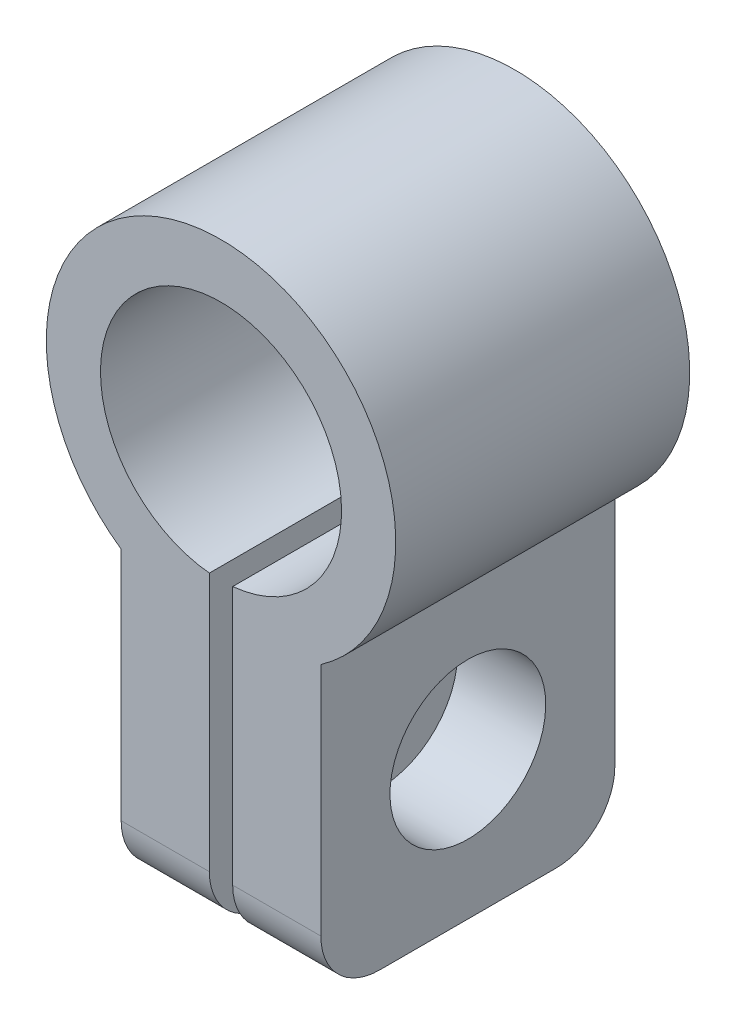
ISO-10303-21;
HEADER;
FILE_DESCRIPTION(('STEP AP214'),'2;1');
FILE_NAME('part.step','',(''),(''),'','','');
FILE_SCHEMA(('AUTOMOTIVE_DESIGN { 1 0 10303 214 1 1 1 1 }'));
ENDSEC;
DATA;
#1=APPLICATION_CONTEXT('core data for automotive mechanical design processes');
#2=APPLICATION_PROTOCOL_DEFINITION('international standard','automotive_design',2000,#1);
#3=PRODUCT_CONTEXT('',#1,'mechanical');
#4=PRODUCT('Part','Part','',(#3));
#5=PRODUCT_RELATED_PRODUCT_CATEGORY('part','',(#4));
#6=PRODUCT_DEFINITION_FORMATION('','',#4);
#7=PRODUCT_DEFINITION_CONTEXT('part definition',#1,'design');
#8=PRODUCT_DEFINITION('design','',#6,#7);
#9=PRODUCT_DEFINITION_SHAPE('','',#8);
#10=(LENGTH_UNIT() NAMED_UNIT(*) SI_UNIT(.MILLI.,.METRE.));
#11=(NAMED_UNIT(*) PLANE_ANGLE_UNIT() SI_UNIT($,.RADIAN.));
#12=(NAMED_UNIT(*) SI_UNIT($,.STERADIAN.) SOLID_ANGLE_UNIT());
#13=UNCERTAINTY_MEASURE_WITH_UNIT(LENGTH_MEASURE(1.E-05),#10,'distance_accuracy_value','');
#14=(GEOMETRIC_REPRESENTATION_CONTEXT(3) GLOBAL_UNCERTAINTY_ASSIGNED_CONTEXT((#13)) GLOBAL_UNIT_ASSIGNED_CONTEXT((#10,
#11,#12)) REPRESENTATION_CONTEXT('',''));
#15=CARTESIAN_POINT('',(0.,0.,0.));
#16=DIRECTION('',(0.,0.,1.));
#17=DIRECTION('',(1.,0.,0.));
#18=AXIS2_PLACEMENT_3D('',#15,#16,#17);
#19=CARTESIAN_POINT('',(0.,0.,10.));
#20=DIRECTION('',(0.,0.,-1.));
#21=DIRECTION('',(-1.,0.,0.));
#22=AXIS2_PLACEMENT_3D('',#19,#20,#21);
#23=CYLINDRICAL_SURFACE('',#22,4.1);
#24=CARTESIAN_POINT('',(0.,0.,0.));
#25=DIRECTION('',(0.,0.,-1.));
#26=DIRECTION('',(1.,0.,0.));
#27=AXIS2_PLACEMENT_3D('',#24,#25,#26);
#28=CIRCLE('',#27,4.1);
#29=CARTESIAN_POINT('',(-0.396848810495057,-4.08074883098784,0.));
#30=VERTEX_POINT('',#29);
#31=CARTESIAN_POINT('',(0.396848810495057,-4.08074883098784,0.));
#32=VERTEX_POINT('',#31);
#33=EDGE_CURVE('E156',#30,#32,#28,.T.);
#34=ORIENTED_EDGE('',*,*,#33,.T.);
#35=DIRECTION('',(0.,0.,-1.));
#36=VECTOR('',#35,1.);
#37=CARTESIAN_POINT('',(0.396848810495057,-4.08074883098784,10.));
#38=LINE('',#37,#36);
#39=CARTESIAN_POINT('',(0.396848810495057,-4.08074883098784,10.));
#40=VERTEX_POINT('',#39);
#41=EDGE_CURVE('E137',#40,#32,#38,.T.);
#42=ORIENTED_EDGE('',*,*,#41,.F.);
#43=CARTESIAN_POINT('',(0.,0.,10.));
#44=DIRECTION('',(0.,0.,-1.));
#45=DIRECTION('',(1.,0.,0.));
#46=AXIS2_PLACEMENT_3D('',#43,#44,#45);
#47=CIRCLE('',#46,4.1);
#48=CARTESIAN_POINT('',(-0.396848810495057,-4.08074883098784,10.));
#49=VERTEX_POINT('',#48);
#50=EDGE_CURVE('E142',#49,#40,#47,.T.);
#51=ORIENTED_EDGE('',*,*,#50,.F.);
#52=DIRECTION('',(0.,0.,-1.));
#53=VECTOR('',#52,1.);
#54=CARTESIAN_POINT('',(-0.396848810495057,-4.08074883098784,10.));
#55=LINE('',#54,#53);
#56=EDGE_CURVE('E234',#49,#30,#55,.T.);
#57=ORIENTED_EDGE('',*,*,#56,.T.);
#58=EDGE_LOOP('',(#34,#42,#51,#57));
#59=FACE_BOUND('',#58,.T.);
#60=ADVANCED_FACE('F42',(#59),#23,.F.);
#61=CARTESIAN_POINT('',(0.396848810495057,-4.08074883098784,10.));
#62=DIRECTION('',(1.,0.,0.));
#63=DIRECTION('',(0.,1.,0.));
#64=AXIS2_PLACEMENT_3D('',#61,#62,#63);
#65=PLANE('',#64);
#66=CARTESIAN_POINT('',(0.396848810495058,-9.87796998961877,5.));
#67=DIRECTION('',(1.,0.,0.));
#68=DIRECTION('',(0.,1.,0.));
#69=AXIS2_PLACEMENT_3D('',#66,#67,#68);
#70=CIRCLE('',#69,2.65);
#71=CARTESIAN_POINT('',(0.396848810495058,-7.22796998961877,5.));
#72=VERTEX_POINT('',#71);
#73=EDGE_CURVE('E238',#72,#72,#70,.T.);
#74=ORIENTED_EDGE('',*,*,#73,.T.);
#75=EDGE_LOOP('',(#74));
#76=FACE_BOUND('',#75,.T.);
#77=DIRECTION('',(0.,-1.,0.));
#78=VECTOR('',#77,1.);
#79=CARTESIAN_POINT('',(0.396848810495057,-4.08074883098784,0.));
#80=LINE('',#79,#78);
#81=CARTESIAN_POINT('',(0.396848810495058,-12.8779699896188,0.));
#82=VERTEX_POINT('',#81);
#83=EDGE_CURVE('E237',#32,#82,#80,.T.);
#84=ORIENTED_EDGE('',*,*,#83,.T.);
#85=CARTESIAN_POINT('',(0.396848810495058,-12.8779699896188,2.));
#86=DIRECTION('',(1.,0.,0.));
#87=DIRECTION('',(0.,1.,0.));
#88=AXIS2_PLACEMENT_3D('',#85,#86,#87);
#89=CIRCLE('',#88,2.);
#90=CARTESIAN_POINT('',(0.396848810495059,-14.8779699896188,2.));
#91=VERTEX_POINT('',#90);
#92=EDGE_CURVE('E211',#82,#91,#89,.F.);
#93=ORIENTED_EDGE('',*,*,#92,.T.);
#94=DIRECTION('',(0.,0.,-1.));
#95=VECTOR('',#94,1.);
#96=CARTESIAN_POINT('',(0.396848810495059,-14.8779699896188,10.));
#97=LINE('',#96,#95);
#98=CARTESIAN_POINT('',(0.396848810495059,-14.8779699896188,8.));
#99=VERTEX_POINT('',#98);
#100=EDGE_CURVE('E159',#99,#91,#97,.T.);
#101=ORIENTED_EDGE('',*,*,#100,.F.);
#102=CARTESIAN_POINT('',(0.396848810495058,-12.8779699896188,8.));
#103=DIRECTION('',(1.,0.,0.));
#104=DIRECTION('',(0.,1.,0.));
#105=AXIS2_PLACEMENT_3D('',#102,#103,#104);
#106=CIRCLE('',#105,2.);
#107=CARTESIAN_POINT('',(0.396848810495058,-12.8779699896188,10.));
#108=VERTEX_POINT('',#107);
#109=EDGE_CURVE('E58',#99,#108,#106,.F.);
#110=ORIENTED_EDGE('',*,*,#109,.T.);
#111=DIRECTION('',(0.,-1.,0.));
#112=VECTOR('',#111,1.);
#113=CARTESIAN_POINT('',(0.396848810495057,-4.08074883098784,10.));
#114=LINE('',#113,#112);
#115=EDGE_CURVE('E132',#40,#108,#114,.T.);
#116=ORIENTED_EDGE('',*,*,#115,.F.);
#117=ORIENTED_EDGE('',*,*,#41,.T.);
#118=EDGE_LOOP('',(#84,#93,#101,#110,#116,#117));
#119=FACE_BOUND('',#118,.T.);
#120=ADVANCED_FACE('F135',(#76,#119),#65,.F.);
#121=CARTESIAN_POINT('',(0.396848810495059,-14.8779699896188,10.));
#122=DIRECTION('',(0.,1.,0.));
#123=DIRECTION('',(0.,0.,1.));
#124=AXIS2_PLACEMENT_3D('',#121,#122,#123);
#125=PLANE('',#124);
#126=ORIENTED_EDGE('',*,*,#100,.T.);
#127=DIRECTION('',(1.,0.,0.));
#128=VECTOR('',#127,1.);
#129=CARTESIAN_POINT('',(0.396848810495059,-14.8779699896188,2.));
#130=LINE('',#129,#128);
#131=CARTESIAN_POINT('',(3.39684881049506,-14.8779699896188,2.));
#132=VERTEX_POINT('',#131);
#133=EDGE_CURVE('E200',#91,#132,#130,.T.);
#134=ORIENTED_EDGE('',*,*,#133,.T.);
#135=DIRECTION('',(0.,0.,-1.));
#136=VECTOR('',#135,1.);
#137=CARTESIAN_POINT('',(3.39684881049506,-14.8779699896188,10.));
#138=LINE('',#137,#136);
#139=CARTESIAN_POINT('',(3.39684881049506,-14.8779699896188,8.));
#140=VERTEX_POINT('',#139);
#141=EDGE_CURVE('E166',#140,#132,#138,.T.);
#142=ORIENTED_EDGE('',*,*,#141,.F.);
#143=DIRECTION('',(1.,0.,0.));
#144=VECTOR('',#143,1.);
#145=CARTESIAN_POINT('',(0.396848810495059,-14.8779699896188,8.));
#146=LINE('',#145,#144);
#147=EDGE_CURVE('E197',#140,#99,#146,.F.);
#148=ORIENTED_EDGE('',*,*,#147,.T.);
#149=EDGE_LOOP('',(#126,#134,#142,#148));
#150=FACE_BOUND('',#149,.T.);
#151=ADVANCED_FACE('F271',(#150),#125,.F.);
#152=CARTESIAN_POINT('',(3.39684881049506,-14.8779699896188,10.));
#153=DIRECTION('',(-1.,0.,0.));
#154=DIRECTION('',(0.,-1.,0.));
#155=AXIS2_PLACEMENT_3D('',#152,#153,#154);
#156=PLANE('',#155);
#157=CARTESIAN_POINT('',(3.39684881049506,-9.87796998961877,5.));
#158=DIRECTION('',(1.,0.,0.));
#159=DIRECTION('',(0.,1.,0.));
#160=AXIS2_PLACEMENT_3D('',#157,#158,#159);
#161=CIRCLE('',#160,2.65);
#162=CARTESIAN_POINT('',(3.39684881049506,-7.22796998961877,5.));
#163=VERTEX_POINT('',#162);
#164=EDGE_CURVE('E174',#163,#163,#161,.T.);
#165=ORIENTED_EDGE('',*,*,#164,.F.);
#166=EDGE_LOOP('',(#165));
#167=FACE_BOUND('',#166,.T.);
#168=ORIENTED_EDGE('',*,*,#141,.T.);
#169=CARTESIAN_POINT('',(3.39684881049506,-12.8779699896188,2.));
#170=DIRECTION('',(-1.,0.,0.));
#171=DIRECTION('',(0.,-1.,0.));
#172=AXIS2_PLACEMENT_3D('',#169,#170,#171);
#173=CIRCLE('',#172,2.);
#174=CARTESIAN_POINT('',(3.39684881049506,-12.8779699896188,0.));
#175=VERTEX_POINT('',#174);
#176=EDGE_CURVE('E206',#132,#175,#173,.F.);
#177=ORIENTED_EDGE('',*,*,#176,.T.);
#178=DIRECTION('',(0.,1.,0.));
#179=VECTOR('',#178,1.);
#180=CARTESIAN_POINT('',(3.39684881049506,-14.8779699896188,0.));
#181=LINE('',#180,#179);
#182=CARTESIAN_POINT('',(3.39684881049505,-4.87796998961876,0.));
#183=VERTEX_POINT('',#182);
#184=EDGE_CURVE('E241',#175,#183,#181,.T.);
#185=ORIENTED_EDGE('',*,*,#184,.T.);
#186=DIRECTION('',(0.,0.,-1.));
#187=VECTOR('',#186,1.);
#188=CARTESIAN_POINT('',(3.39684881049505,-4.87796998961876,10.));
#189=LINE('',#188,#187);
#190=CARTESIAN_POINT('',(3.39684881049505,-4.87796998961876,10.));
#191=VERTEX_POINT('',#190);
#192=EDGE_CURVE('E221',#191,#183,#189,.T.);
#193=ORIENTED_EDGE('',*,*,#192,.F.);
#194=DIRECTION('',(0.,1.,0.));
#195=VECTOR('',#194,1.);
#196=CARTESIAN_POINT('',(3.39684881049506,-14.8779699896188,10.));
#197=LINE('',#196,#195);
#198=CARTESIAN_POINT('',(3.39684881049506,-12.8779699896188,10.));
#199=VERTEX_POINT('',#198);
#200=EDGE_CURVE('E141',#199,#191,#197,.T.);
#201=ORIENTED_EDGE('',*,*,#200,.F.);
#202=CARTESIAN_POINT('',(3.39684881049506,-12.8779699896188,8.));
#203=DIRECTION('',(-1.,0.,0.));
#204=DIRECTION('',(0.,-1.,0.));
#205=AXIS2_PLACEMENT_3D('',#202,#203,#204);
#206=CIRCLE('',#205,2.);
#207=EDGE_CURVE('E66',#199,#140,#206,.F.);
#208=ORIENTED_EDGE('',*,*,#207,.T.);
#209=EDGE_LOOP('',(#168,#177,#185,#193,#201,#208));
#210=FACE_BOUND('',#209,.T.);
#211=ADVANCED_FACE('F218',(#167,#210),#156,.F.);
#212=CARTESIAN_POINT('',(0.,0.,10.));
#213=DIRECTION('',(0.,0.,-1.));
#214=DIRECTION('',(-1.,0.,0.));
#215=AXIS2_PLACEMENT_3D('',#212,#213,#214);
#216=CYLINDRICAL_SURFACE('',#215,5.94417135191971);
#217=CARTESIAN_POINT('',(0.,0.,0.));
#218=DIRECTION('',(0.,0.,1.));
#219=DIRECTION('',(1.,0.,0.));
#220=AXIS2_PLACEMENT_3D('',#217,#218,#219);
#221=CIRCLE('',#220,5.94417135191971);
#222=CARTESIAN_POINT('',(-3.39684881049506,-4.87796998961876,0.));
#223=VERTEX_POINT('',#222);
#224=EDGE_CURVE('E244',#183,#223,#221,.T.);
#225=ORIENTED_EDGE('',*,*,#224,.T.);
#226=DIRECTION('',(0.,0.,-1.));
#227=VECTOR('',#226,1.);
#228=CARTESIAN_POINT('',(-3.39684881049506,-4.87796998961876,10.));
#229=LINE('',#228,#227);
#230=CARTESIAN_POINT('',(-3.39684881049506,-4.87796998961876,10.));
#231=VERTEX_POINT('',#230);
#232=EDGE_CURVE('E263',#231,#223,#229,.T.);
#233=ORIENTED_EDGE('',*,*,#232,.F.);
#234=CARTESIAN_POINT('',(0.,0.,10.));
#235=DIRECTION('',(0.,0.,1.));
#236=DIRECTION('',(1.,0.,0.));
#237=AXIS2_PLACEMENT_3D('',#234,#235,#236);
#238=CIRCLE('',#237,5.94417135191971);
#239=EDGE_CURVE('E224',#191,#231,#238,.T.);
#240=ORIENTED_EDGE('',*,*,#239,.F.);
#241=ORIENTED_EDGE('',*,*,#192,.T.);
#242=EDGE_LOOP('',(#225,#233,#240,#241));
#243=FACE_BOUND('',#242,.T.);
#244=ADVANCED_FACE('F307',(#243),#216,.T.);
#245=CARTESIAN_POINT('',(-3.39684881049505,-14.8779699896188,10.));
#246=DIRECTION('',(1.,0.,0.));
#247=DIRECTION('',(0.,1.,0.));
#248=AXIS2_PLACEMENT_3D('',#245,#246,#247);
#249=PLANE('',#248);
#250=CARTESIAN_POINT('',(-3.39684881049506,-9.87796998961877,5.));
#251=DIRECTION('',(1.,0.,0.));
#252=DIRECTION('',(0.,1.,0.));
#253=AXIS2_PLACEMENT_3D('',#250,#251,#252);
#254=CIRCLE('',#253,2.65);
#255=CARTESIAN_POINT('',(-3.39684881049506,-7.22796998961877,5.));
#256=VERTEX_POINT('',#255);
#257=EDGE_CURVE('E173',#256,#256,#254,.T.);
#258=ORIENTED_EDGE('',*,*,#257,.T.);
#259=EDGE_LOOP('',(#258));
#260=FACE_BOUND('',#259,.T.);
#261=DIRECTION('',(0.,-1.,0.));
#262=VECTOR('',#261,1.);
#263=CARTESIAN_POINT('',(-3.39684881049505,-14.8779699896188,0.));
#264=LINE('',#263,#262);
#265=CARTESIAN_POINT('',(-3.39684881049506,-12.8779699896188,0.));
#266=VERTEX_POINT('',#265);
#267=EDGE_CURVE('E247',#223,#266,#264,.T.);
#268=ORIENTED_EDGE('',*,*,#267,.T.);
#269=CARTESIAN_POINT('',(-3.39684881049506,-12.8779699896188,2.));
#270=DIRECTION('',(1.,0.,0.));
#271=DIRECTION('',(0.,1.,0.));
#272=AXIS2_PLACEMENT_3D('',#269,#270,#271);
#273=CIRCLE('',#272,2.);
#274=CARTESIAN_POINT('',(-3.39684881049505,-14.8779699896188,2.));
#275=VERTEX_POINT('',#274);
#276=EDGE_CURVE('E194',#266,#275,#273,.F.);
#277=ORIENTED_EDGE('',*,*,#276,.T.);
#278=DIRECTION('',(0.,0.,-1.));
#279=VECTOR('',#278,1.);
#280=CARTESIAN_POINT('',(-3.39684881049505,-14.8779699896188,10.));
#281=LINE('',#280,#279);
#282=CARTESIAN_POINT('',(-3.39684881049505,-14.8779699896188,8.));
#283=VERTEX_POINT('',#282);
#284=EDGE_CURVE('E259',#283,#275,#281,.T.);
#285=ORIENTED_EDGE('',*,*,#284,.F.);
#286=CARTESIAN_POINT('',(-3.39684881049506,-12.8779699896188,8.));
#287=DIRECTION('',(1.,0.,0.));
#288=DIRECTION('',(0.,1.,0.));
#289=AXIS2_PLACEMENT_3D('',#286,#287,#288);
#290=CIRCLE('',#289,2.);
#291=CARTESIAN_POINT('',(-3.39684881049506,-12.8779699896188,10.));
#292=VERTEX_POINT('',#291);
#293=EDGE_CURVE('E191',#283,#292,#290,.F.);
#294=ORIENTED_EDGE('',*,*,#293,.T.);
#295=DIRECTION('',(0.,-1.,0.));
#296=VECTOR('',#295,1.);
#297=CARTESIAN_POINT('',(-3.39684881049505,-14.8779699896188,10.));
#298=LINE('',#297,#296);
#299=EDGE_CURVE('E227',#231,#292,#298,.T.);
#300=ORIENTED_EDGE('',*,*,#299,.F.);
#301=ORIENTED_EDGE('',*,*,#232,.T.);
#302=EDGE_LOOP('',(#268,#277,#285,#294,#300,#301));
#303=FACE_BOUND('',#302,.T.);
#304=ADVANCED_FACE('F323',(#260,#303),#249,.F.);
#305=CARTESIAN_POINT('',(-0.396848810495055,-14.8779699896188,10.));
#306=DIRECTION('',(0.,1.,0.));
#307=DIRECTION('',(0.,0.,1.));
#308=AXIS2_PLACEMENT_3D('',#305,#306,#307);
#309=PLANE('',#308);
#310=ORIENTED_EDGE('',*,*,#284,.T.);
#311=DIRECTION('',(1.,0.,0.));
#312=VECTOR('',#311,1.);
#313=CARTESIAN_POINT('',(-0.396848810495055,-14.8779699896188,2.));
#314=LINE('',#313,#312);
#315=CARTESIAN_POINT('',(-0.396848810495055,-14.8779699896188,2.));
#316=VERTEX_POINT('',#315);
#317=EDGE_CURVE('E163',#275,#316,#314,.T.);
#318=ORIENTED_EDGE('',*,*,#317,.T.);
#319=DIRECTION('',(0.,0.,-1.));
#320=VECTOR('',#319,1.);
#321=CARTESIAN_POINT('',(-0.396848810495055,-14.8779699896188,10.));
#322=LINE('',#321,#320);
#323=CARTESIAN_POINT('',(-0.396848810495055,-14.8779699896188,8.));
#324=VERTEX_POINT('',#323);
#325=EDGE_CURVE('E255',#324,#316,#322,.T.);
#326=ORIENTED_EDGE('',*,*,#325,.F.);
#327=DIRECTION('',(1.,0.,0.));
#328=VECTOR('',#327,1.);
#329=CARTESIAN_POINT('',(-3.39684881049505,-14.8779699896188,8.));
#330=LINE('',#329,#328);
#331=EDGE_CURVE('E158',#324,#283,#330,.F.);
#332=ORIENTED_EDGE('',*,*,#331,.T.);
#333=EDGE_LOOP('',(#310,#318,#326,#332));
#334=FACE_BOUND('',#333,.T.);
#335=ADVANCED_FACE('F318',(#334),#309,.F.);
#336=CARTESIAN_POINT('',(-0.396848810495057,-4.08074883098784,10.));
#337=DIRECTION('',(-1.,0.,0.));
#338=DIRECTION('',(0.,-1.,0.));
#339=AXIS2_PLACEMENT_3D('',#336,#337,#338);
#340=PLANE('',#339);
#341=CARTESIAN_POINT('',(-0.396848810495056,-9.87796998961877,5.));
#342=DIRECTION('',(-1.,0.,0.));
#343=DIRECTION('',(0.,-1.,0.));
#344=AXIS2_PLACEMENT_3D('',#341,#342,#343);
#345=CIRCLE('',#344,2.65);
#346=CARTESIAN_POINT('',(-0.396848810495056,-12.5279699896188,5.));
#347=VERTEX_POINT('',#346);
#348=EDGE_CURVE('E170',#347,#347,#345,.T.);
#349=ORIENTED_EDGE('',*,*,#348,.T.);
#350=EDGE_LOOP('',(#349));
#351=FACE_BOUND('',#350,.T.);
#352=ORIENTED_EDGE('',*,*,#325,.T.);
#353=CARTESIAN_POINT('',(-0.396848810495055,-12.8779699896188,2.));
#354=DIRECTION('',(-1.,0.,0.));
#355=DIRECTION('',(0.,-1.,0.));
#356=AXIS2_PLACEMENT_3D('',#353,#354,#355);
#357=CIRCLE('',#356,2.);
#358=CARTESIAN_POINT('',(-0.396848810495055,-12.8779699896188,0.));
#359=VERTEX_POINT('',#358);
#360=EDGE_CURVE('E182',#316,#359,#357,.F.);
#361=ORIENTED_EDGE('',*,*,#360,.T.);
#362=DIRECTION('',(0.,1.,0.));
#363=VECTOR('',#362,1.);
#364=CARTESIAN_POINT('',(-0.396848810495057,-4.08074883098784,0.));
#365=LINE('',#364,#363);
#366=EDGE_CURVE('E153',#359,#30,#365,.T.);
#367=ORIENTED_EDGE('',*,*,#366,.T.);
#368=ORIENTED_EDGE('',*,*,#56,.F.);
#369=DIRECTION('',(0.,1.,0.));
#370=VECTOR('',#369,1.);
#371=CARTESIAN_POINT('',(-0.396848810495057,-4.08074883098784,10.));
#372=LINE('',#371,#370);
#373=CARTESIAN_POINT('',(-0.396848810495055,-12.8779699896188,10.));
#374=VERTEX_POINT('',#373);
#375=EDGE_CURVE('E148',#374,#49,#372,.T.);
#376=ORIENTED_EDGE('',*,*,#375,.F.);
#377=CARTESIAN_POINT('',(-0.396848810495055,-12.8779699896188,8.));
#378=DIRECTION('',(-1.,0.,0.));
#379=DIRECTION('',(0.,-1.,0.));
#380=AXIS2_PLACEMENT_3D('',#377,#378,#379);
#381=CIRCLE('',#380,2.);
#382=EDGE_CURVE('E179',#374,#324,#381,.F.);
#383=ORIENTED_EDGE('',*,*,#382,.T.);
#384=EDGE_LOOP('',(#352,#361,#367,#368,#376,#383));
#385=FACE_BOUND('',#384,.T.);
#386=ADVANCED_FACE('F316',(#351,#385),#340,.F.);
#387=CARTESIAN_POINT('',(0.,0.,10.));
#388=DIRECTION('',(0.,0.,1.));
#389=DIRECTION('',(1.,0.,0.));
#390=AXIS2_PLACEMENT_3D('',#387,#388,#389);
#391=PLANE('',#390);
#392=ORIENTED_EDGE('',*,*,#299,.T.);
#393=DIRECTION('',(1.,0.,0.));
#394=VECTOR('',#393,1.);
#395=CARTESIAN_POINT('',(-0.396848810495055,-12.8779699896188,10.));
#396=LINE('',#395,#394);
#397=EDGE_CURVE('E11',#292,#374,#396,.T.);
#398=ORIENTED_EDGE('',*,*,#397,.T.);
#399=ORIENTED_EDGE('',*,*,#375,.T.);
#400=ORIENTED_EDGE('',*,*,#50,.T.);
#401=ORIENTED_EDGE('',*,*,#115,.T.);
#402=DIRECTION('',(1.,0.,0.));
#403=VECTOR('',#402,1.);
#404=CARTESIAN_POINT('',(3.39684881049506,-12.8779699896188,10.));
#405=LINE('',#404,#403);
#406=EDGE_CURVE('E51',#108,#199,#405,.T.);
#407=ORIENTED_EDGE('',*,*,#406,.T.);
#408=ORIENTED_EDGE('',*,*,#200,.T.);
#409=ORIENTED_EDGE('',*,*,#239,.T.);
#410=EDGE_LOOP('',(#392,#398,#399,#400,#401,#407,#408,#409));
#411=FACE_BOUND('',#410,.T.);
#412=ADVANCED_FACE('F146',(#411),#391,.T.);
#413=CARTESIAN_POINT('',(0.,0.,0.));
#414=DIRECTION('',(0.,0.,1.));
#415=DIRECTION('',(1.,0.,0.));
#416=AXIS2_PLACEMENT_3D('',#413,#414,#415);
#417=PLANE('',#416);
#418=ORIENTED_EDGE('',*,*,#366,.F.);
#419=DIRECTION('',(1.,0.,0.));
#420=VECTOR('',#419,1.);
#421=CARTESIAN_POINT('',(0.,-12.8779699896188,0.));
#422=LINE('',#421,#420);
#423=EDGE_CURVE('E188',#359,#266,#422,.F.);
#424=ORIENTED_EDGE('',*,*,#423,.T.);
#425=ORIENTED_EDGE('',*,*,#267,.F.);
#426=ORIENTED_EDGE('',*,*,#224,.F.);
#427=ORIENTED_EDGE('',*,*,#184,.F.);
#428=DIRECTION('',(1.,0.,0.));
#429=VECTOR('',#428,1.);
#430=CARTESIAN_POINT('',(0.,-12.8779699896188,0.));
#431=LINE('',#430,#429);
#432=EDGE_CURVE('E185',#175,#82,#431,.F.);
#433=ORIENTED_EDGE('',*,*,#432,.T.);
#434=ORIENTED_EDGE('',*,*,#83,.F.);
#435=ORIENTED_EDGE('',*,*,#33,.F.);
#436=EDGE_LOOP('',(#418,#424,#425,#426,#427,#433,#434,#435));
#437=FACE_BOUND('',#436,.T.);
#438=ADVANCED_FACE('F303',(#437),#417,.F.);
#439=CARTESIAN_POINT('',(-6.60315118950494,-9.87796998961877,5.));
#440=DIRECTION('',(1.,0.,0.));
#441=DIRECTION('',(0.,1.,0.));
#442=AXIS2_PLACEMENT_3D('',#439,#440,#441);
#443=CYLINDRICAL_SURFACE('',#442,2.65);
#444=ORIENTED_EDGE('',*,*,#348,.F.);
#445=EDGE_LOOP('',(#444));
#446=FACE_BOUND('',#445,.T.);
#447=ORIENTED_EDGE('',*,*,#257,.F.);
#448=EDGE_LOOP('',(#447));
#449=FACE_BOUND('',#448,.T.);
#450=ADVANCED_FACE('F392',(#446,#449),#443,.F.);
#451=ORIENTED_EDGE('',*,*,#164,.T.);
#452=EDGE_LOOP('',(#451));
#453=FACE_BOUND('',#452,.T.);
#454=ORIENTED_EDGE('',*,*,#73,.F.);
#455=EDGE_LOOP('',(#454));
#456=FACE_BOUND('',#455,.T.);
#457=ADVANCED_FACE('F293',(#453,#456),#443,.F.);
#458=CARTESIAN_POINT('',(-0.396848810495055,-12.8779699896188,2.));
#459=DIRECTION('',(1.,0.,0.));
#460=DIRECTION('',(0.,0.,-1.));
#461=AXIS2_PLACEMENT_3D('',#458,#459,#460);
#462=CYLINDRICAL_SURFACE('',#461,2.);
#463=ORIENTED_EDGE('',*,*,#276,.F.);
#464=ORIENTED_EDGE('',*,*,#423,.F.);
#465=ORIENTED_EDGE('',*,*,#360,.F.);
#466=ORIENTED_EDGE('',*,*,#317,.F.);
#467=EDGE_LOOP('',(#463,#464,#465,#466));
#468=FACE_BOUND('',#467,.T.);
#469=ADVANCED_FACE('F290',(#468),#462,.T.);
#470=CARTESIAN_POINT('',(0.396848810495059,-12.8779699896188,2.));
#471=DIRECTION('',(1.,0.,0.));
#472=DIRECTION('',(0.,0.,-1.));
#473=AXIS2_PLACEMENT_3D('',#470,#471,#472);
#474=CYLINDRICAL_SURFACE('',#473,2.);
#475=ORIENTED_EDGE('',*,*,#92,.F.);
#476=ORIENTED_EDGE('',*,*,#432,.F.);
#477=ORIENTED_EDGE('',*,*,#176,.F.);
#478=ORIENTED_EDGE('',*,*,#133,.F.);
#479=EDGE_LOOP('',(#475,#476,#477,#478));
#480=FACE_BOUND('',#479,.T.);
#481=ADVANCED_FACE('F278',(#480),#474,.T.);
#482=CARTESIAN_POINT('',(0.,-12.8779699896188,8.));
#483=DIRECTION('',(-1.,0.,0.));
#484=DIRECTION('',(0.,0.,1.));
#485=AXIS2_PLACEMENT_3D('',#482,#483,#484);
#486=CYLINDRICAL_SURFACE('',#485,2.);
#487=ORIENTED_EDGE('',*,*,#293,.F.);
#488=ORIENTED_EDGE('',*,*,#331,.F.);
#489=ORIENTED_EDGE('',*,*,#382,.F.);
#490=ORIENTED_EDGE('',*,*,#397,.F.);
#491=EDGE_LOOP('',(#487,#488,#489,#490));
#492=FACE_BOUND('',#491,.T.);
#493=ADVANCED_FACE('F274',(#492),#486,.T.);
#494=CARTESIAN_POINT('',(0.,-12.8779699896188,8.));
#495=DIRECTION('',(-1.,0.,0.));
#496=DIRECTION('',(0.,0.,1.));
#497=AXIS2_PLACEMENT_3D('',#494,#495,#496);
#498=CYLINDRICAL_SURFACE('',#497,2.);
#499=ORIENTED_EDGE('',*,*,#109,.F.);
#500=ORIENTED_EDGE('',*,*,#147,.F.);
#501=ORIENTED_EDGE('',*,*,#207,.F.);
#502=ORIENTED_EDGE('',*,*,#406,.F.);
#503=EDGE_LOOP('',(#499,#500,#501,#502));
#504=FACE_BOUND('',#503,.T.);
#505=ADVANCED_FACE('F44',(#504),#498,.T.);
#506=CLOSED_SHELL('',(#60,#120,#151,#211,#244,#304,#335,#386,#412,#438,#450,#457,#469,#481,#493,#505));
#507=MANIFOLD_SOLID_BREP('B2',#506);
#508=ADVANCED_BREP_SHAPE_REPRESENTATION('',(#18,#507),#14);
#509=SHAPE_DEFINITION_REPRESENTATION(#9,#508);
ENDSEC;
END-ISO-10303-21;
